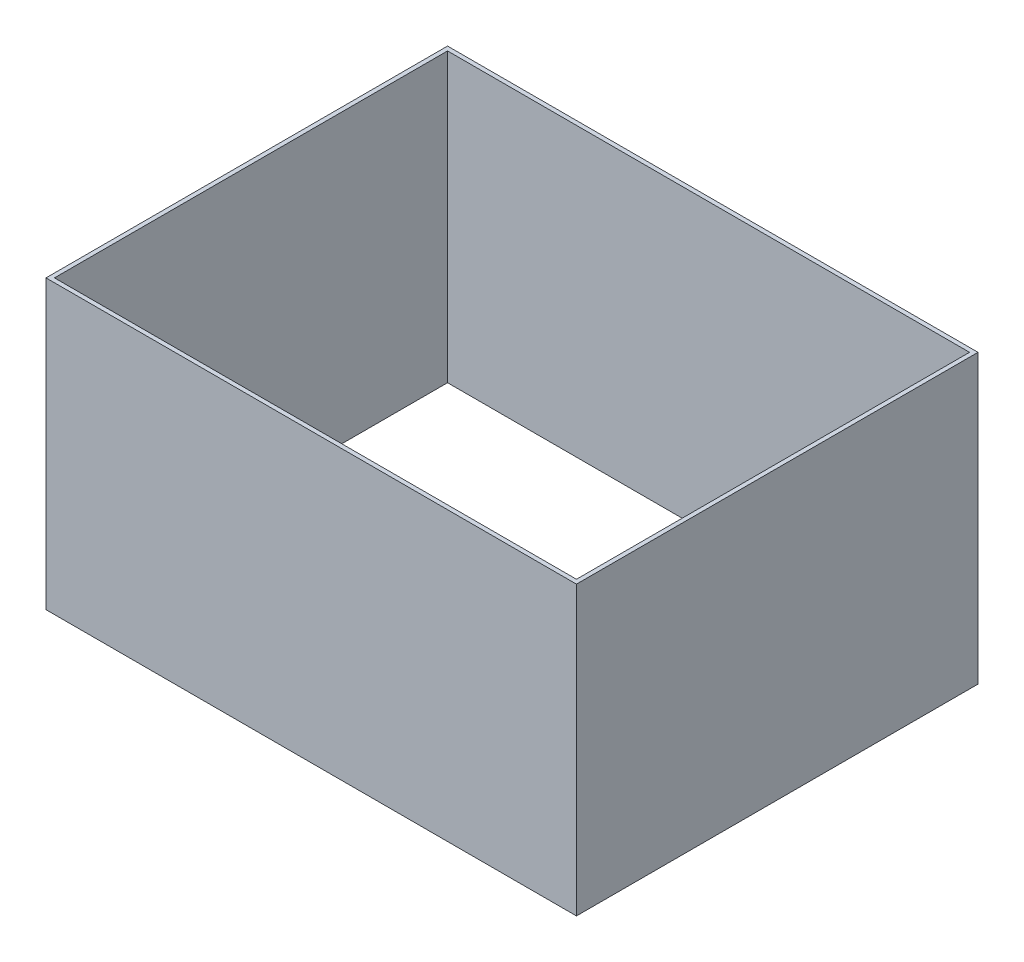
ISO-10303-21;
HEADER;
FILE_DESCRIPTION(('STEP AP214'),'2;1');
FILE_NAME('part.step','',(''),(''),'','','');
FILE_SCHEMA(('AUTOMOTIVE_DESIGN { 1 0 10303 214 1 1 1 1 }'));
ENDSEC;
DATA;
#1=APPLICATION_CONTEXT('core data for automotive mechanical design processes');
#2=APPLICATION_PROTOCOL_DEFINITION('international standard','automotive_design',2000,#1);
#3=PRODUCT_CONTEXT('',#1,'mechanical');
#4=PRODUCT('Part','Part','',(#3));
#5=PRODUCT_RELATED_PRODUCT_CATEGORY('part','',(#4));
#6=PRODUCT_DEFINITION_FORMATION('','',#4);
#7=PRODUCT_DEFINITION_CONTEXT('part definition',#1,'design');
#8=PRODUCT_DEFINITION('design','',#6,#7);
#9=PRODUCT_DEFINITION_SHAPE('','',#8);
#10=(LENGTH_UNIT() NAMED_UNIT(*) SI_UNIT(.MILLI.,.METRE.));
#11=(NAMED_UNIT(*) PLANE_ANGLE_UNIT() SI_UNIT($,.RADIAN.));
#12=(NAMED_UNIT(*) SI_UNIT($,.STERADIAN.) SOLID_ANGLE_UNIT());
#13=UNCERTAINTY_MEASURE_WITH_UNIT(LENGTH_MEASURE(1.E-05),#10,'distance_accuracy_value','');
#14=(GEOMETRIC_REPRESENTATION_CONTEXT(3) GLOBAL_UNCERTAINTY_ASSIGNED_CONTEXT((#13)) GLOBAL_UNIT_ASSIGNED_CONTEXT((#10,
#11,#12)) REPRESENTATION_CONTEXT('',''));
#15=CARTESIAN_POINT('',(0.,0.,0.));
#16=DIRECTION('',(0.,0.,1.));
#17=DIRECTION('',(1.,0.,0.));
#18=AXIS2_PLACEMENT_3D('',#15,#16,#17);
#19=CARTESIAN_POINT('',(-3.11501454937761E-13,1359.75,-990.03093024748));
#20=DIRECTION('',(0.,0.,-1.));
#21=DIRECTION('',(-1.,0.,0.));
#22=AXIS2_PLACEMENT_3D('',#19,#20,#21);
#23=PLANE('',#22);
#24=DIRECTION('',(1.,0.,0.));
#25=VECTOR('',#24,1.);
#26=CARTESIAN_POINT('',(-3.11501454937761E-13,0.,-990.03093024748));
#27=LINE('',#26,#25);
#28=CARTESIAN_POINT('',(-844.613003095976,0.,-990.03093024748));
#29=VERTEX_POINT('',#28);
#30=CARTESIAN_POINT('',(1625.38699690402,0.,-990.030930247481));
#31=VERTEX_POINT('',#30);
#32=EDGE_CURVE('E142',#29,#31,#27,.T.);
#33=ORIENTED_EDGE('',*,*,#32,.T.);
#34=DIRECTION('',(0.,-1.,0.));
#35=VECTOR('',#34,1.);
#36=CARTESIAN_POINT('',(1625.38699690402,1359.75,-990.030930247481));
#37=LINE('',#36,#35);
#38=CARTESIAN_POINT('',(1625.38699690402,1359.75,-990.030930247481));
#39=VERTEX_POINT('',#38);
#40=EDGE_CURVE('E11',#39,#31,#37,.T.);
#41=ORIENTED_EDGE('',*,*,#40,.F.);
#42=DIRECTION('',(1.,0.,0.));
#43=VECTOR('',#42,1.);
#44=CARTESIAN_POINT('',(-3.11501454937761E-13,1359.75,-990.03093024748));
#45=LINE('',#44,#43);
#46=CARTESIAN_POINT('',(-844.613003095976,1359.75,-990.03093024748));
#47=VERTEX_POINT('',#46);
#48=EDGE_CURVE('E119',#47,#39,#45,.T.);
#49=ORIENTED_EDGE('',*,*,#48,.F.);
#50=DIRECTION('',(0.,-1.,0.));
#51=VECTOR('',#50,1.);
#52=CARTESIAN_POINT('',(-844.613003095976,1359.75,-990.03093024748));
#53=LINE('',#52,#51);
#54=EDGE_CURVE('E149',#47,#29,#53,.T.);
#55=ORIENTED_EDGE('',*,*,#54,.T.);
#56=EDGE_LOOP('',(#33,#41,#49,#55));
#57=FACE_BOUND('',#56,.T.);
#58=ADVANCED_FACE('F37',(#57),#23,.F.);
#59=CARTESIAN_POINT('',(1625.38699690402,1359.75,-9.70183907467299E-13));
#60=DIRECTION('',(1.,0.,0.));
#61=DIRECTION('',(0.,0.,-1.));
#62=AXIS2_PLACEMENT_3D('',#59,#60,#61);
#63=PLANE('',#62);
#64=DIRECTION('',(0.,0.,1.));
#65=VECTOR('',#64,1.);
#66=CARTESIAN_POINT('',(1625.38699690402,0.,-9.70183907467299E-13));
#67=LINE('',#66,#65);
#68=CARTESIAN_POINT('',(1625.38699690402,0.,869.96906975253));
#69=VERTEX_POINT('',#68);
#70=EDGE_CURVE('E124',#31,#69,#67,.T.);
#71=ORIENTED_EDGE('',*,*,#70,.T.);
#72=DIRECTION('',(0.,-1.,0.));
#73=VECTOR('',#72,1.);
#74=CARTESIAN_POINT('',(1625.38699690402,1359.75,869.96906975253));
#75=LINE('',#74,#73);
#76=CARTESIAN_POINT('',(1625.38699690402,1359.75,869.96906975253));
#77=VERTEX_POINT('',#76);
#78=EDGE_CURVE('E47',#77,#69,#75,.T.);
#79=ORIENTED_EDGE('',*,*,#78,.F.);
#80=DIRECTION('',(0.,0.,1.));
#81=VECTOR('',#80,1.);
#82=CARTESIAN_POINT('',(1625.38699690402,1359.75,-9.70183907467299E-13));
#83=LINE('',#82,#81);
#84=EDGE_CURVE('E113',#39,#77,#83,.T.);
#85=ORIENTED_EDGE('',*,*,#84,.F.);
#86=ORIENTED_EDGE('',*,*,#40,.T.);
#87=EDGE_LOOP('',(#71,#79,#85,#86));
#88=FACE_BOUND('',#87,.T.);
#89=ADVANCED_FACE('F123',(#88),#63,.F.);
#90=CARTESIAN_POINT('',(-3.75394860029531E-12,1359.75,869.969069752523));
#91=DIRECTION('',(0.,0.,1.));
#92=DIRECTION('',(1.,0.,0.));
#93=AXIS2_PLACEMENT_3D('',#90,#91,#92);
#94=PLANE('',#93);
#95=DIRECTION('',(-1.,0.,0.));
#96=VECTOR('',#95,1.);
#97=CARTESIAN_POINT('',(-3.75394860029531E-12,0.,869.969069752523));
#98=LINE('',#97,#96);
#99=CARTESIAN_POINT('',(-844.613003095975,0.,869.969069752519));
#100=VERTEX_POINT('',#99);
#101=EDGE_CURVE('E85',#69,#100,#98,.T.);
#102=ORIENTED_EDGE('',*,*,#101,.T.);
#103=DIRECTION('',(0.,-1.,0.));
#104=VECTOR('',#103,1.);
#105=CARTESIAN_POINT('',(-844.613003095975,1359.75,869.969069752519));
#106=LINE('',#105,#104);
#107=CARTESIAN_POINT('',(-844.613003095975,1359.75,869.969069752519));
#108=VERTEX_POINT('',#107);
#109=EDGE_CURVE('E125',#108,#100,#106,.T.);
#110=ORIENTED_EDGE('',*,*,#109,.F.);
#111=DIRECTION('',(-1.,0.,0.));
#112=VECTOR('',#111,1.);
#113=CARTESIAN_POINT('',(-3.75394860029531E-12,1359.75,869.969069752523));
#114=LINE('',#113,#112);
#115=EDGE_CURVE('E117',#77,#108,#114,.T.);
#116=ORIENTED_EDGE('',*,*,#115,.F.);
#117=ORIENTED_EDGE('',*,*,#78,.T.);
#118=EDGE_LOOP('',(#102,#110,#116,#117));
#119=FACE_BOUND('',#118,.T.);
#120=ADVANCED_FACE('F127',(#119),#94,.F.);
#121=CARTESIAN_POINT('',(-3.73968503912873E-12,1359.75,889.969069752534));
#122=DIRECTION('',(0.,0.,-1.));
#123=DIRECTION('',(-1.,0.,0.));
#124=AXIS2_PLACEMENT_3D('',#121,#122,#123);
#125=PLANE('',#124);
#126=DIRECTION('',(1.,0.,0.));
#127=VECTOR('',#126,1.);
#128=CARTESIAN_POINT('',(-3.73968503912873E-12,0.,889.969069752534));
#129=LINE('',#128,#127);
#130=CARTESIAN_POINT('',(-864.613003095986,0.,889.96906975253));
#131=VERTEX_POINT('',#130);
#132=CARTESIAN_POINT('',(1645.38699690403,0.,889.969069752541));
#133=VERTEX_POINT('',#132);
#134=EDGE_CURVE('E133',#131,#133,#129,.T.);
#135=ORIENTED_EDGE('',*,*,#134,.T.);
#136=DIRECTION('',(0.,-1.,0.));
#137=VECTOR('',#136,1.);
#138=CARTESIAN_POINT('',(1645.38699690403,1359.75,889.969069752541));
#139=LINE('',#138,#137);
#140=CARTESIAN_POINT('',(1645.38699690403,1359.75,889.969069752541));
#141=VERTEX_POINT('',#140);
#142=EDGE_CURVE('E41',#141,#133,#139,.T.);
#143=ORIENTED_EDGE('',*,*,#142,.F.);
#144=DIRECTION('',(1.,0.,0.));
#145=VECTOR('',#144,1.);
#146=CARTESIAN_POINT('',(-3.73968503912873E-12,1359.75,889.969069752534));
#147=LINE('',#146,#145);
#148=CARTESIAN_POINT('',(-864.613003095986,1359.75,889.96906975253));
#149=VERTEX_POINT('',#148);
#150=EDGE_CURVE('E148',#149,#141,#147,.T.);
#151=ORIENTED_EDGE('',*,*,#150,.F.);
#152=DIRECTION('',(0.,-1.,0.));
#153=VECTOR('',#152,1.);
#154=CARTESIAN_POINT('',(-864.613003095986,1359.75,889.96906975253));
#155=LINE('',#154,#153);
#156=EDGE_CURVE('E129',#149,#131,#155,.T.);
#157=ORIENTED_EDGE('',*,*,#156,.T.);
#158=EDGE_LOOP('',(#135,#143,#151,#157));
#159=FACE_BOUND('',#158,.T.);
#160=ADVANCED_FACE('F39',(#159),#125,.F.);
#161=CARTESIAN_POINT('',(1645.38699690403,1359.75,0.));
#162=DIRECTION('',(-1.,0.,0.));
#163=DIRECTION('',(0.,0.,1.));
#164=AXIS2_PLACEMENT_3D('',#161,#162,#163);
#165=PLANE('',#164);
#166=DIRECTION('',(0.,0.,-1.));
#167=VECTOR('',#166,1.);
#168=CARTESIAN_POINT('',(1645.38699690403,0.,0.));
#169=LINE('',#168,#167);
#170=CARTESIAN_POINT('',(1645.38699690403,0.,-1010.03093024749));
#171=VERTEX_POINT('',#170);
#172=EDGE_CURVE('E136',#133,#171,#169,.T.);
#173=ORIENTED_EDGE('',*,*,#172,.T.);
#174=DIRECTION('',(0.,-1.,0.));
#175=VECTOR('',#174,1.);
#176=CARTESIAN_POINT('',(1645.38699690403,1359.75,-1010.03093024749));
#177=LINE('',#176,#175);
#178=CARTESIAN_POINT('',(1645.38699690403,1359.75,-1010.03093024749));
#179=VERTEX_POINT('',#178);
#180=EDGE_CURVE('E156',#179,#171,#177,.T.);
#181=ORIENTED_EDGE('',*,*,#180,.F.);
#182=DIRECTION('',(0.,0.,-1.));
#183=VECTOR('',#182,1.);
#184=CARTESIAN_POINT('',(1645.38699690403,1359.75,0.));
#185=LINE('',#184,#183);
#186=EDGE_CURVE('E100',#141,#179,#185,.T.);
#187=ORIENTED_EDGE('',*,*,#186,.F.);
#188=ORIENTED_EDGE('',*,*,#142,.T.);
#189=EDGE_LOOP('',(#173,#181,#187,#188));
#190=FACE_BOUND('',#189,.T.);
#191=ADVANCED_FACE('F162',(#190),#165,.F.);
#192=CARTESIAN_POINT('',(-3.57405448396596E-13,1359.75,-1010.03093024749));
#193=DIRECTION('',(0.,0.,1.));
#194=DIRECTION('',(1.,0.,0.));
#195=AXIS2_PLACEMENT_3D('',#192,#193,#194);
#196=PLANE('',#195);
#197=DIRECTION('',(-1.,0.,0.));
#198=VECTOR('',#197,1.);
#199=CARTESIAN_POINT('',(-3.57405448396596E-13,0.,-1010.03093024749));
#200=LINE('',#199,#198);
#201=CARTESIAN_POINT('',(-864.613003095986,0.,-1010.03093024749));
#202=VERTEX_POINT('',#201);
#203=EDGE_CURVE('E138',#171,#202,#200,.T.);
#204=ORIENTED_EDGE('',*,*,#203,.T.);
#205=DIRECTION('',(0.,-1.,0.));
#206=VECTOR('',#205,1.);
#207=CARTESIAN_POINT('',(-864.613003095986,1359.75,-1010.03093024749));
#208=LINE('',#207,#206);
#209=CARTESIAN_POINT('',(-864.613003095986,1359.75,-1010.03093024749));
#210=VERTEX_POINT('',#209);
#211=EDGE_CURVE('E154',#210,#202,#208,.T.);
#212=ORIENTED_EDGE('',*,*,#211,.F.);
#213=DIRECTION('',(-1.,0.,0.));
#214=VECTOR('',#213,1.);
#215=CARTESIAN_POINT('',(-3.57405448396596E-13,1359.75,-1010.03093024749));
#216=LINE('',#215,#214);
#217=EDGE_CURVE('E178',#179,#210,#216,.T.);
#218=ORIENTED_EDGE('',*,*,#217,.F.);
#219=ORIENTED_EDGE('',*,*,#180,.T.);
#220=EDGE_LOOP('',(#204,#212,#218,#219));
#221=FACE_BOUND('',#220,.T.);
#222=ADVANCED_FACE('F172',(#221),#196,.F.);
#223=CARTESIAN_POINT('',(-864.613003095986,1359.75,0.));
#224=DIRECTION('',(1.,0.,0.));
#225=DIRECTION('',(0.,0.,-1.));
#226=AXIS2_PLACEMENT_3D('',#223,#224,#225);
#227=PLANE('',#226);
#228=DIRECTION('',(0.,0.,1.));
#229=VECTOR('',#228,1.);
#230=CARTESIAN_POINT('',(-864.613003095986,0.,0.));
#231=LINE('',#230,#229);
#232=EDGE_CURVE('E140',#202,#131,#231,.T.);
#233=ORIENTED_EDGE('',*,*,#232,.T.);
#234=ORIENTED_EDGE('',*,*,#156,.F.);
#235=DIRECTION('',(0.,0.,1.));
#236=VECTOR('',#235,1.);
#237=CARTESIAN_POINT('',(-864.613003095986,1359.75,0.));
#238=LINE('',#237,#236);
#239=EDGE_CURVE('E176',#210,#149,#238,.T.);
#240=ORIENTED_EDGE('',*,*,#239,.F.);
#241=ORIENTED_EDGE('',*,*,#211,.T.);
#242=EDGE_LOOP('',(#233,#234,#240,#241));
#243=FACE_BOUND('',#242,.T.);
#244=ADVANCED_FACE('F175',(#243),#227,.F.);
#245=CARTESIAN_POINT('',(-844.613003095975,1359.75,2.52072258853481E-13));
#246=DIRECTION('',(-1.,0.,0.));
#247=DIRECTION('',(0.,0.,1.));
#248=AXIS2_PLACEMENT_3D('',#245,#246,#247);
#249=PLANE('',#248);
#250=DIRECTION('',(0.,0.,-1.));
#251=VECTOR('',#250,1.);
#252=CARTESIAN_POINT('',(-844.613003095975,0.,2.52072258853481E-13));
#253=LINE('',#252,#251);
#254=EDGE_CURVE('E91',#100,#29,#253,.T.);
#255=ORIENTED_EDGE('',*,*,#254,.T.);
#256=ORIENTED_EDGE('',*,*,#54,.F.);
#257=DIRECTION('',(0.,0.,-1.));
#258=VECTOR('',#257,1.);
#259=CARTESIAN_POINT('',(-844.613003095975,1359.75,2.52072258853481E-13));
#260=LINE('',#259,#258);
#261=EDGE_CURVE('E56',#108,#47,#260,.T.);
#262=ORIENTED_EDGE('',*,*,#261,.F.);
#263=ORIENTED_EDGE('',*,*,#109,.T.);
#264=EDGE_LOOP('',(#255,#256,#262,#263));
#265=FACE_BOUND('',#264,.T.);
#266=ADVANCED_FACE('F184',(#265),#249,.F.);
#267=CARTESIAN_POINT('',(0.,1359.75,0.));
#268=DIRECTION('',(0.,1.,0.));
#269=DIRECTION('',(0.,0.,1.));
#270=AXIS2_PLACEMENT_3D('',#267,#268,#269);
#271=PLANE('',#270);
#272=ORIENTED_EDGE('',*,*,#150,.T.);
#273=ORIENTED_EDGE('',*,*,#186,.T.);
#274=ORIENTED_EDGE('',*,*,#217,.T.);
#275=ORIENTED_EDGE('',*,*,#239,.T.);
#276=EDGE_LOOP('',(#272,#273,#274,#275));
#277=FACE_BOUND('',#276,.T.);
#278=ORIENTED_EDGE('',*,*,#48,.T.);
#279=ORIENTED_EDGE('',*,*,#84,.T.);
#280=ORIENTED_EDGE('',*,*,#115,.T.);
#281=ORIENTED_EDGE('',*,*,#261,.T.);
#282=EDGE_LOOP('',(#278,#279,#280,#281));
#283=FACE_BOUND('',#282,.T.);
#284=ADVANCED_FACE('F115',(#277,#283),#271,.T.);
#285=CARTESIAN_POINT('',(0.,0.,0.));
#286=DIRECTION('',(0.,1.,0.));
#287=DIRECTION('',(0.,0.,1.));
#288=AXIS2_PLACEMENT_3D('',#285,#286,#287);
#289=PLANE('',#288);
#290=ORIENTED_EDGE('',*,*,#134,.F.);
#291=ORIENTED_EDGE('',*,*,#232,.F.);
#292=ORIENTED_EDGE('',*,*,#203,.F.);
#293=ORIENTED_EDGE('',*,*,#172,.F.);
#294=EDGE_LOOP('',(#290,#291,#292,#293));
#295=FACE_BOUND('',#294,.T.);
#296=ORIENTED_EDGE('',*,*,#32,.F.);
#297=ORIENTED_EDGE('',*,*,#254,.F.);
#298=ORIENTED_EDGE('',*,*,#101,.F.);
#299=ORIENTED_EDGE('',*,*,#70,.F.);
#300=EDGE_LOOP('',(#296,#297,#298,#299));
#301=FACE_BOUND('',#300,.T.);
#302=ADVANCED_FACE('F169',(#295,#301),#289,.F.);
#303=CLOSED_SHELL('',(#58,#89,#120,#160,#191,#222,#244,#266,#284,#302));
#304=MANIFOLD_SOLID_BREP('B2',#303);
#305=ADVANCED_BREP_SHAPE_REPRESENTATION('',(#18,#304),#14);
#306=SHAPE_DEFINITION_REPRESENTATION(#9,#305);
ENDSEC;
END-ISO-10303-21;
